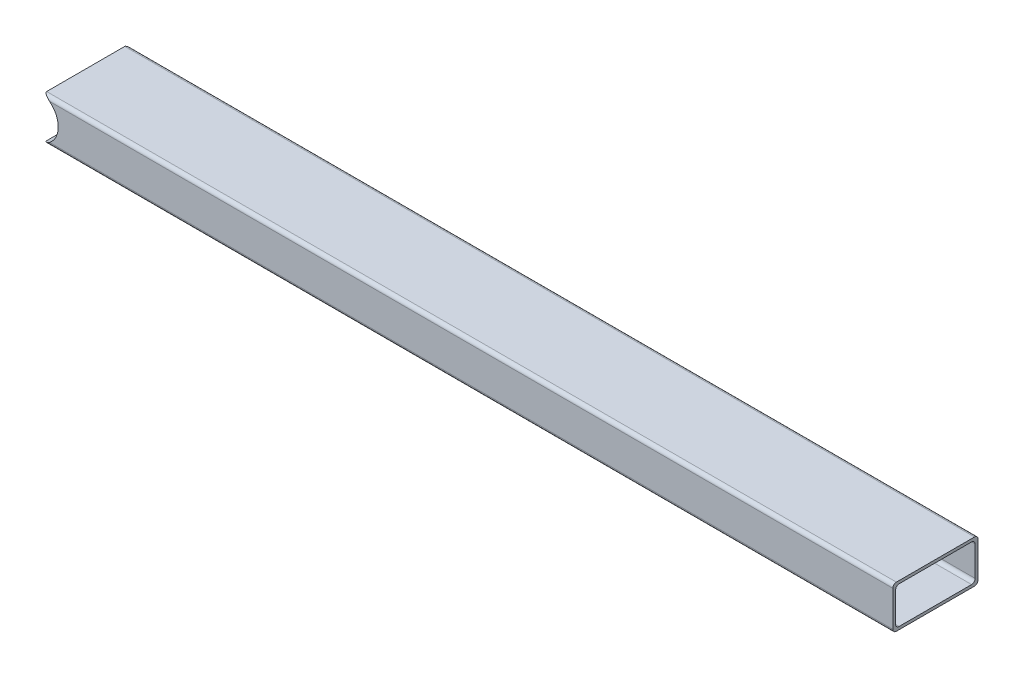
ISO-10303-21;
HEADER;
FILE_DESCRIPTION(('STEP AP214'),'2;1');
FILE_NAME('part.step','',(''),(''),'','','');
FILE_SCHEMA(('AUTOMOTIVE_DESIGN { 1 0 10303 214 1 1 1 1 }'));
ENDSEC;
DATA;
#1=APPLICATION_CONTEXT('core data for automotive mechanical design processes');
#2=APPLICATION_PROTOCOL_DEFINITION('international standard','automotive_design',2000,#1);
#3=PRODUCT_CONTEXT('',#1,'mechanical');
#4=PRODUCT('Part','Part','',(#3));
#5=PRODUCT_RELATED_PRODUCT_CATEGORY('part','',(#4));
#6=PRODUCT_DEFINITION_FORMATION('','',#4);
#7=PRODUCT_DEFINITION_CONTEXT('part definition',#1,'design');
#8=PRODUCT_DEFINITION('design','',#6,#7);
#9=PRODUCT_DEFINITION_SHAPE('','',#8);
#10=(LENGTH_UNIT() NAMED_UNIT(*) SI_UNIT(.MILLI.,.METRE.));
#11=(NAMED_UNIT(*) PLANE_ANGLE_UNIT() SI_UNIT($,.RADIAN.));
#12=(NAMED_UNIT(*) SI_UNIT($,.STERADIAN.) SOLID_ANGLE_UNIT());
#13=UNCERTAINTY_MEASURE_WITH_UNIT(LENGTH_MEASURE(1.E-05),#10,'distance_accuracy_value','');
#14=(GEOMETRIC_REPRESENTATION_CONTEXT(3) GLOBAL_UNCERTAINTY_ASSIGNED_CONTEXT((#13)) GLOBAL_UNIT_ASSIGNED_CONTEXT((#10,
#11,#12)) REPRESENTATION_CONTEXT('',''));
#15=CARTESIAN_POINT('',(0.,0.,0.));
#16=DIRECTION('',(0.,0.,1.));
#17=DIRECTION('',(1.,0.,0.));
#18=AXIS2_PLACEMENT_3D('',#15,#16,#17);
#19=CARTESIAN_POINT('',(141.560193104558,-568.340939138859,-360.400000000085));
#20=DIRECTION('',(0.,0.,1.));
#21=DIRECTION('',(1.,0.,0.));
#22=AXIS2_PLACEMENT_3D('',#19,#20,#21);
#23=CYLINDRICAL_SURFACE('',#22,15.875);
#24=CARTESIAN_POINT('',(150.671233235459,-581.341115012004,25.5002134171229));
#25=CARTESIAN_POINT('',(150.671337385321,-581.341042019641,14.9168800845537));
#26=CARTESIAN_POINT('',(150.67144153252,-581.340969027277,4.33354675198452));
#27=CARTESIAN_POINT('',(150.671608821795,-581.340851778307,-12.6666552993716));
#28=CARTESIAN_POINT('',(150.671671965554,-581.340807521701,-19.0835240181585));
#29=CARTESIAN_POINT('',(150.671735108335,-581.340763265095,-25.5003927369454));
#30=B_SPLINE_CURVE_WITH_KNOTS('',3,(#24,#25,#26,#27,#28,#29),.UNSPECIFIED.,.F.,.F.,(4,2,4),(0.,
31.75,51.0006061577506),.UNSPECIFIED.);
#31=CARTESIAN_POINT('',(150.671233238442,-581.341115009914,25.4999103394822));
#32=VERTEX_POINT('',#31);
#33=CARTESIAN_POINT('',(150.671735105353,-581.340763267185,-25.5000896593048));
#34=VERTEX_POINT('',#33);
#35=EDGE_CURVE('E390',#32,#34,#30,.T.);
#36=ORIENTED_EDGE('',*,*,#35,.T.);
#37=CARTESIAN_POINT('',(150.671735105353,-581.340763267185,-25.5000896593048));
#38=CARTESIAN_POINT('',(150.671724740158,-581.340769042363,-25.5434593284995));
#39=CARTESIAN_POINT('',(150.673347295286,-581.339633405624,-25.5868058944149));
#40=CARTESIAN_POINT('',(150.679752954679,-581.335140800036,-25.6731036581527));
#41=CARTESIAN_POINT('',(150.684532684228,-581.331786203036,-25.7160552285373));
#42=CARTESIAN_POINT('',(150.703314436117,-581.318581383306,-25.8429814188296));
#43=CARTESIAN_POINT('',(150.721764169259,-581.305587034561,-25.9260089492833));
#44=CARTESIAN_POINT('',(150.774635228102,-581.268079115068,-26.1072807184071));
#45=CARTESIAN_POINT('',(150.811865284832,-581.241520989509,-26.2042577694934));
#46=CARTESIAN_POINT('',(150.898252510698,-581.179129201596,-26.389846726002));
#47=CARTESIAN_POINT('',(150.947463625063,-581.143253536413,-26.4784182049457));
#48=CARTESIAN_POINT('',(151.081795550703,-581.04388163559,-26.6900917327287));
#49=CARTESIAN_POINT('',(151.172356877129,-580.975676536271,-26.8074819680901));
#50=CARTESIAN_POINT('',(151.364649906966,-580.827056540889,-27.0238563912852));
#51=CARTESIAN_POINT('',(151.46640559311,-580.746615283404,-27.1227997877319));
#52=CARTESIAN_POINT('',(151.650951561989,-580.596663782149,-27.2821194496427));
#53=CARTESIAN_POINT('',(151.732396042496,-580.529197188731,-27.346041720352));
#54=CARTESIAN_POINT('',(151.89767804964,-580.389331083137,-27.4648536647019));
#55=CARTESIAN_POINT('',(151.981516732739,-580.316929162827,-27.5197388835585));
#56=CARTESIAN_POINT('',(152.150543982105,-580.167722786603,-27.6207547168568));
#57=CARTESIAN_POINT('',(152.23573277091,-580.090917599328,-27.6668838714404));
#58=CARTESIAN_POINT('',(152.406667758729,-579.9333127361,-27.7504703647247));
#59=CARTESIAN_POINT('',(152.49241395954,-579.852513047269,-27.7879276754655));
#60=CARTESIAN_POINT('',(152.653521305737,-579.697200526691,-27.8501036772195));
#61=CARTESIAN_POINT('',(152.728895386147,-579.623094892509,-27.8758110739384));
#62=CARTESIAN_POINT('',(152.879144238304,-579.472349452878,-27.9202524860116));
#63=CARTESIAN_POINT('',(152.954019092371,-579.395710078309,-27.9389876804624));
#64=CARTESIAN_POINT('',(153.102645678205,-579.240430336656,-27.9691824579158));
#65=CARTESIAN_POINT('',(153.176400294298,-579.161797381228,-27.9806657715706));
#66=CARTESIAN_POINT('',(153.322679095938,-579.002613456592,-27.9961067100675));
#67=CARTESIAN_POINT('',(153.395202747289,-578.922061689377,-28.0000611464125));
#68=CARTESIAN_POINT('',(153.466900472855,-578.840746024954,-28.0000724169546));
#69=B_SPLINE_CURVE_WITH_KNOTS('',3,(#37,#38,#39,#40,#41,#42,#43,#44,#45,#46,#47,#48,#49,#50,#51,
#52,#53,#54,#55,#56,#57,#58,#59,#60,#61,#62,#63,#64,#65,#66,#67,#68),.UNSPECIFIED.,.F.,.F.,(4,2,
2,2,2,2,2,2,2,2,2,2,2,2,2,4),(0.,0.130021305051418,0.259903854250835,0.516766632018359,
0.836677150095597,1.15805561978013,1.64496489505425,2.13293842034373,2.5032067018028,
2.87365696281978,3.24416893314642,3.6146820980576,3.94078731041697,4.26683734875833,
4.59181483371996,4.91692991681842),.UNSPECIFIED.);
#70=CARTESIAN_POINT('',(153.466900472855,-578.840746024954,-28.0000724169547));
#71=VERTEX_POINT('',#70);
#72=EDGE_CURVE('E11',#34,#71,#69,.T.);
#73=ORIENTED_EDGE('',*,*,#72,.T.);
#74=CARTESIAN_POINT('',(141.560193104539,-568.340939138859,-28.0000000006659));
#75=DIRECTION('',(0.,-6.89691624925466E-06,0.999999999976216));
#76=DIRECTION('',(-8.1120670294192E-09,0.999999999976216,6.89691624925466E-06));
#77=AXIS2_PLACEMENT_3D('',#74,#75,#76);
#78=ELLIPSE('',#77,15.8750000003776,15.875);
#79=CARTESIAN_POINT('',(153.466559871156,-557.840746025454,-27.9999275817135));
#80=VERTEX_POINT('',#79);
#81=EDGE_CURVE('E50',#71,#80,#78,.T.);
#82=ORIENTED_EDGE('',*,*,#81,.T.);
#83=CARTESIAN_POINT('',(153.466559871156,-557.840746025454,-27.9999275817135));
#84=CARTESIAN_POINT('',(153.381357930957,-557.744112697063,-27.9999025387216));
#85=CARTESIAN_POINT('',(153.294992056708,-557.648572258908,-27.9943246864022));
#86=CARTESIAN_POINT('',(153.120618021198,-557.460289423955,-27.9726277123364));
#87=CARTESIAN_POINT('',(153.032610544349,-557.367545901489,-27.9565128922455));
#88=CARTESIAN_POINT('',(152.854673508493,-557.184468731572,-27.9140920744911));
#89=CARTESIAN_POINT('',(152.764733512917,-557.094168919915,-27.8876847085412));
#90=CARTESIAN_POINT('',(152.584472574793,-556.917418958187,-27.8250575623649));
#91=CARTESIAN_POINT('',(152.494151595365,-556.830969190641,-27.7888368096386));
#92=CARTESIAN_POINT('',(152.313284972021,-556.66180933274,-27.706503036701));
#93=CARTESIAN_POINT('',(152.222741708963,-556.579127331163,-27.6603269985373));
#94=CARTESIAN_POINT('',(152.042878908961,-556.418546045526,-27.5581692049726));
#95=CARTESIAN_POINT('',(151.953559735813,-556.340648160326,-27.5021845998406));
#96=CARTESIAN_POINT('',(151.77766255734,-556.19053786675,-27.3803699873678));
#97=CARTESIAN_POINT('',(151.691074662908,-556.118303075231,-27.3145820687989));
#98=CARTESIAN_POINT('',(151.521841075046,-555.979988051988,-27.1724530480761));
#99=CARTESIAN_POINT('',(151.439191522435,-555.913901732253,-27.0961225750045));
#100=CARTESIAN_POINT('',(151.283808928789,-555.791987294539,-26.9359480947763));
#101=CARTESIAN_POINT('',(151.210789428949,-555.735817266383,-26.8526474185353));
#102=CARTESIAN_POINT('',(151.07309004408,-555.631578476553,-26.6747115598047));
#103=CARTESIAN_POINT('',(151.008404264037,-555.583503980877,-26.5800844816807));
#104=CARTESIAN_POINT('',(150.902144962238,-555.505554294453,-26.3970480925649));
#105=CARTESIAN_POINT('',(150.858507098863,-555.473960631199,-26.3105921850348));
#106=CARTESIAN_POINT('',(150.782973970687,-555.419712104383,-26.1302544251232));
#107=CARTESIAN_POINT('',(150.751036862204,-555.397025367027,-26.0364005223173));
#108=CARTESIAN_POINT('',(150.708692045263,-555.367077755644,-25.8687933325471));
#109=CARTESIAN_POINT('',(150.694810978372,-555.357314178782,-25.7963758746574));
#110=CARTESIAN_POINT('',(150.680752164422,-555.347438536368,-25.6862285097691));
#111=CARTESIAN_POINT('',(150.67719255099,-555.344941325467,-25.6491177946825));
#112=CARTESIAN_POINT('',(150.672429003798,-555.34160124147,-25.5746461882155));
#113=CARTESIAN_POINT('',(150.671226703414,-555.340759515454,-25.5372851413542));
#114=CARTESIAN_POINT('',(150.671233238444,-555.340763267804,-25.4999103394823));
#115=B_SPLINE_CURVE_WITH_KNOTS('',3,(#83,#84,#85,#86,#87,#88,#89,#90,#91,#92,#93,#94,#95,#96,
#97,#98,#99,#100,#101,#102,#103,#104,#105,#106,#107,#108,#109,#110,#111,#112,#113,#114),
.UNSPECIFIED.,.F.,.F.,(4,2,2,2,2,2,2,2,2,2,2,2,2,2,2,4),(0.,0.38629182579771,0.772426048587235,
1.16246340773881,1.5525394334701,1.94516124479344,2.33789731619553,2.72899339571216,
3.11969800906227,3.49146979114634,3.86297713243278,4.16752405381394,4.47097098531204,
4.69327700735073,4.80526921589077,4.9173389961871),.UNSPECIFIED.);
#116=CARTESIAN_POINT('',(150.671233238444,-555.340763267804,-25.4999103394823));
#117=VERTEX_POINT('',#116);
#118=EDGE_CURVE('E637',#80,#117,#115,.T.);
#119=ORIENTED_EDGE('',*,*,#118,.T.);
#120=CARTESIAN_POINT('',(150.671233235462,-555.340763265713,-25.5002134171229));
#121=CARTESIAN_POINT('',(150.671337385322,-555.340836258077,-14.9168800845538));
#122=CARTESIAN_POINT('',(150.67144153252,-555.340909250441,-4.33354675198461));
#123=CARTESIAN_POINT('',(150.671608821792,-555.34102649941,12.6666552993717));
#124=CARTESIAN_POINT('',(150.671671965551,-555.341070756017,19.0835240181588));
#125=CARTESIAN_POINT('',(150.671735108331,-555.341115012623,25.5003927369459));
#126=B_SPLINE_CURVE_WITH_KNOTS('',3,(#120,#121,#122,#123,#124,#125),.UNSPECIFIED.,.F.,.F.,(4,2,
4),(0.,31.75,51.0006061577512),.UNSPECIFIED.);
#127=CARTESIAN_POINT('',(150.671735105349,-555.341115010532,25.5000896593047));
#128=VERTEX_POINT('',#127);
#129=EDGE_CURVE('E644',#117,#128,#126,.T.);
#130=ORIENTED_EDGE('',*,*,#129,.T.);
#131=CARTESIAN_POINT('',(150.671735105349,-555.341115010532,25.5000896593047));
#132=CARTESIAN_POINT('',(150.671724740154,-555.341109235355,25.5434593284995));
#133=CARTESIAN_POINT('',(150.673347295283,-555.342244872093,25.5868058944148));
#134=CARTESIAN_POINT('',(150.679752954675,-555.346737477681,25.6731036581526));
#135=CARTESIAN_POINT('',(150.684532684224,-555.350092074681,25.7160552285372));
#136=CARTESIAN_POINT('',(150.703314436114,-555.363296894412,25.8429814188295));
#137=CARTESIAN_POINT('',(150.721764169255,-555.376291243157,25.9260089492831));
#138=CARTESIAN_POINT('',(150.774635228098,-555.413799162649,26.1072807184069));
#139=CARTESIAN_POINT('',(150.811865284828,-555.440357288208,26.2042577694932));
#140=CARTESIAN_POINT('',(150.898252510694,-555.502749076121,26.3898467260018));
#141=CARTESIAN_POINT('',(150.947463625059,-555.538624741304,26.4784182049455));
#142=CARTESIAN_POINT('',(151.081795550699,-555.637996642127,26.6900917327285));
#143=CARTESIAN_POINT('',(151.172356877125,-555.706201741446,26.8074819680899));
#144=CARTESIAN_POINT('',(151.364649906962,-555.854821736829,27.0238563912849));
#145=CARTESIAN_POINT('',(151.466405593106,-555.935262994313,27.1227997877316));
#146=CARTESIAN_POINT('',(151.650951561985,-556.085214495568,27.2821194496424));
#147=CARTESIAN_POINT('',(151.732396042492,-556.152681088987,27.3460417203517));
#148=CARTESIAN_POINT('',(151.897678049636,-556.29254719458,27.4648536647016));
#149=CARTESIAN_POINT('',(151.981516732734,-556.364949114891,27.5197388835582));
#150=CARTESIAN_POINT('',(152.150543982101,-556.514155491114,27.6207547168565));
#151=CARTESIAN_POINT('',(152.235732770905,-556.590960678389,27.6668838714401));
#152=CARTESIAN_POINT('',(152.406667758725,-556.748565541617,27.7504703647244));
#153=CARTESIAN_POINT('',(152.492413959536,-556.829365230449,27.7879276754652));
#154=CARTESIAN_POINT('',(152.653521305733,-556.984677751026,27.8501036772193));
#155=CARTESIAN_POINT('',(152.728895386143,-557.058783385209,27.8758110739382));
#156=CARTESIAN_POINT('',(152.8791442383,-557.20952882484,27.9202524860114));
#157=CARTESIAN_POINT('',(152.954019092368,-557.286168199409,27.9389876804623));
#158=CARTESIAN_POINT('',(153.102645678201,-557.441447941061,27.9691824579157));
#159=CARTESIAN_POINT('',(153.176400294294,-557.520080896489,27.9806657715705));
#160=CARTESIAN_POINT('',(153.322679095935,-557.679264821126,27.9961067100674));
#161=CARTESIAN_POINT('',(153.395202747285,-557.75981658834,28.0000611464124));
#162=CARTESIAN_POINT('',(153.466900472852,-557.841132252764,28.0000724169545));
#163=B_SPLINE_CURVE_WITH_KNOTS('',3,(#131,#132,#133,#134,#135,#136,#137,#138,#139,#140,#141,
#142,#143,#144,#145,#146,#147,#148,#149,#150,#151,#152,#153,#154,#155,#156,#157,#158,#159,#160,
#161,#162),.UNSPECIFIED.,.F.,.F.,(4,2,2,2,2,2,2,2,2,2,2,2,2,2,2,4),(0.,0.130021305051394,
0.25990385425079,0.516766632018279,0.836677150095485,1.15805561977994,1.64496489505399,
2.13293842034328,2.50320670180239,2.8736569628193,3.24416893314581,3.61468209805697,
3.9407873104167,4.26683734875828,4.59181483372026,4.91692991681885),.UNSPECIFIED.);
#164=CARTESIAN_POINT('',(153.466900472852,-557.841132252764,28.0000724169546));
#165=VERTEX_POINT('',#164);
#166=EDGE_CURVE('E651',#128,#165,#163,.T.);
#167=ORIENTED_EDGE('',*,*,#166,.T.);
#168=CARTESIAN_POINT('',(141.560193104536,-568.340939138859,28.0000000006659));
#169=DIRECTION('',(0.,6.89691624925466E-06,-0.999999999976216));
#170=DIRECTION('',(-8.1120670294192E-09,0.999999999976216,6.89691624925466E-06));
#171=AXIS2_PLACEMENT_3D('',#168,#169,#170);
#172=ELLIPSE('',#171,15.8750000003776,15.875);
#173=CARTESIAN_POINT('',(153.466559871153,-578.841132252264,27.9999275817134));
#174=VERTEX_POINT('',#173);
#175=EDGE_CURVE('E658',#165,#174,#172,.T.);
#176=ORIENTED_EDGE('',*,*,#175,.T.);
#177=CARTESIAN_POINT('',(153.466559871153,-578.841132252264,27.9999275817134));
#178=CARTESIAN_POINT('',(153.381357930954,-578.937765580655,27.9999025387215));
#179=CARTESIAN_POINT('',(153.294992056705,-579.03330601881,27.9943246864022));
#180=CARTESIAN_POINT('',(153.120618021195,-579.221588853763,27.9726277123363));
#181=CARTESIAN_POINT('',(153.032610544346,-579.314332376229,27.9565128922454));
#182=CARTESIAN_POINT('',(152.854673508491,-579.497409546146,27.914092074491));
#183=CARTESIAN_POINT('',(152.764733512914,-579.587709357803,27.8876847085412));
#184=CARTESIAN_POINT('',(152.584472574791,-579.764459319531,27.8250575623649));
#185=CARTESIAN_POINT('',(152.494151595362,-579.850909087076,27.7888368096385));
#186=CARTESIAN_POINT('',(152.313284972019,-580.020068944978,27.706503036701));
#187=CARTESIAN_POINT('',(152.22274170896,-580.102750946555,27.6603269985373));
#188=CARTESIAN_POINT('',(152.042878908959,-580.263332232191,27.5581692049726));
#189=CARTESIAN_POINT('',(151.953559735811,-580.341230117391,27.5021845998406));
#190=CARTESIAN_POINT('',(151.777662557337,-580.491340410967,27.3803699873678));
#191=CARTESIAN_POINT('',(151.691074662905,-580.563575202487,27.3145820687989));
#192=CARTESIAN_POINT('',(151.521841075043,-580.70189022573,27.1724530480761));
#193=CARTESIAN_POINT('',(151.439191522433,-580.767976545464,27.0961225750045));
#194=CARTESIAN_POINT('',(151.283808928786,-580.889890983179,26.9359480947763));
#195=CARTESIAN_POINT('',(151.210789428946,-580.946061011334,26.8526474185353));
#196=CARTESIAN_POINT('',(151.073090044077,-581.050299801165,26.6747115598046));
#197=CARTESIAN_POINT('',(151.008404264035,-581.09837429684,26.5800844816806));
#198=CARTESIAN_POINT('',(150.902144962235,-581.176323983264,26.3970480925648));
#199=CARTESIAN_POINT('',(150.858507098861,-581.207917646519,26.3105921850346));
#200=CARTESIAN_POINT('',(150.782973970685,-581.262166173334,26.1302544251231));
#201=CARTESIAN_POINT('',(150.751036862202,-581.284852910691,26.0364005223172));
#202=CARTESIAN_POINT('',(150.708692045261,-581.314800522073,25.868793332547));
#203=CARTESIAN_POINT('',(150.69481097837,-581.324564098935,25.7963758746574));
#204=CARTESIAN_POINT('',(150.680752164419,-581.33443974135,25.6862285097691));
#205=CARTESIAN_POINT('',(150.677192550988,-581.336936952251,25.6491177946824));
#206=CARTESIAN_POINT('',(150.672429003796,-581.340277036248,25.5746461882154));
#207=CARTESIAN_POINT('',(150.671226703412,-581.341118762264,25.5372851413542));
#208=CARTESIAN_POINT('',(150.671233238442,-581.341115009914,25.4999103394822));
#209=B_SPLINE_CURVE_WITH_KNOTS('',3,(#177,#178,#179,#180,#181,#182,#183,#184,#185,#186,#187,
#188,#189,#190,#191,#192,#193,#194,#195,#196,#197,#198,#199,#200,#201,#202,#203,#204,#205,#206,
#207,#208),.UNSPECIFIED.,.F.,.F.,(4,2,2,2,2,2,2,2,2,2,2,2,2,2,2,4),(0.,0.386291825797572,
0.772426048587058,1.16246340773859,1.55253943346974,1.94516124479306,2.33789731619514,
2.72899339571181,3.11969800906197,3.49146979114601,3.86297713243245,4.1675240538136,
4.47097098531167,4.69327700735033,4.80526921589035,4.91733899618667),.UNSPECIFIED.);
#210=EDGE_CURVE('E662',#174,#32,#209,.T.);
#211=ORIENTED_EDGE('',*,*,#210,.T.);
#212=EDGE_LOOP('',(#36,#73,#82,#119,#130,#167,#176,#211));
#213=FACE_BOUND('',#212,.T.);
#214=CARTESIAN_POINT('',(146.758396152766,-553.341128804412,27.5001034530897));
#215=CARTESIAN_POINT('',(146.758383506119,-553.341125064639,27.5275598936779));
#216=CARTESIAN_POINT('',(146.759703445409,-553.341581806523,27.5549967846341));
#217=CARTESIAN_POINT('',(146.764884384735,-553.343378485478,27.6095518705151));
#218=CARTESIAN_POINT('',(146.768740779189,-553.344716821797,27.6366705525607));
#219=CARTESIAN_POINT('',(146.783767278766,-553.34994146609,27.7163824585175));
#220=CARTESIAN_POINT('',(146.798403731944,-553.355040216316,27.7682628578147));
#221=CARTESIAN_POINT('',(146.84068985457,-553.369880241383,27.8838659300772));
#222=CARTESIAN_POINT('',(146.87092256138,-553.380554021841,27.9464885830141));
#223=CARTESIAN_POINT('',(146.940184541986,-553.405321399365,28.0663248734858));
#224=CARTESIAN_POINT('',(146.979277548349,-553.41943983325,28.1234948322476));
#225=CARTESIAN_POINT('',(147.060865553156,-553.449330335612,28.2295814642584));
#226=CARTESIAN_POINT('',(147.103051422029,-553.464967179512,28.2787800731227));
#227=CARTESIAN_POINT('',(147.191004800599,-553.498034967554,28.3732482419194));
#228=CARTESIAN_POINT('',(147.23677570906,-553.515467619252,28.4185139854649));
#229=CARTESIAN_POINT('',(147.377887873853,-553.570016025369,28.5493858370124));
#230=CARTESIAN_POINT('',(147.476972892164,-553.609362089263,28.6300000012975));
#231=CARTESIAN_POINT('',(147.698959399637,-553.700305964486,28.7951880586319));
#232=CARTESIAN_POINT('',(147.822903607052,-553.752828626621,28.877792157373));
#233=CARTESIAN_POINT('',(148.07486111142,-553.86358735437,29.0325231818216));
#234=CARTESIAN_POINT('',(148.202879040178,-553.921830092901,29.1046376213632));
#235=CARTESIAN_POINT('',(148.461302124441,-554.043709310816,29.2400834667107));
#236=CARTESIAN_POINT('',(148.591711344623,-554.107355803816,29.3033979668508));
#237=CARTESIAN_POINT('',(148.85361290289,-554.239762016157,29.4219378857615));
#238=CARTESIAN_POINT('',(148.985105384097,-554.30852242111,29.477162216939));
#239=CARTESIAN_POINT('',(149.269030920686,-554.46219937989,29.5878778398314));
#240=CARTESIAN_POINT('',(149.421520063953,-554.547960123931,29.6420578669621));
#241=CARTESIAN_POINT('',(149.726096362838,-554.726065418531,29.7399427483024));
#242=CARTESIAN_POINT('',(149.878183357702,-554.818412280581,29.7836439010942));
#243=CARTESIAN_POINT('',(150.180599987742,-555.009170198938,29.8598226414711));
#244=CARTESIAN_POINT('',(150.330933899069,-555.107559010696,29.8923387949348));
#245=CARTESIAN_POINT('',(150.629539761159,-555.310393822115,29.9453467731821));
#246=CARTESIAN_POINT('',(150.777812979184,-555.414835874483,29.9658463391113));
#247=CARTESIAN_POINT('',(150.995672085474,-555.573985230232,29.9863222571483));
#248=CARTESIAN_POINT('',(151.066374107322,-555.626541175708,29.9914303877845));
#249=CARTESIAN_POINT('',(151.207014372407,-555.732916127248,29.9983111502308));
#250=CARTESIAN_POINT('',(151.276952404044,-555.786735470853,30.000082880147));
#251=CARTESIAN_POINT('',(151.346448652589,-555.841146046644,30.0000862107396));
#252=B_SPLINE_CURVE_WITH_KNOTS('',3,(#214,#215,#216,#217,#218,#219,#220,#221,#222,#223,#224,
#225,#226,#227,#228,#229,#230,#231,#232,#233,#234,#235,#236,#237,#238,#239,#240,#241,#242,#243,
#244,#245,#246,#247,#248,#249,#250,#251),.UNSPECIFIED.,.F.,.F.,(4,2,2,2,2,2,2,2,2,2,2,2,2,2,2,2,
2,2,4),(0.,0.082299178362135,0.164449332581217,0.326003113518892,0.535884208219377,
0.747325802347879,0.947035043599102,1.14693596396042,1.5470026015685,2.02019895403163,
2.49395403662001,2.96860703428869,3.44332378297308,3.99234697338176,4.5415638086866,
5.08886750284694,5.63581823266106,5.90048430672082,6.16522191489514),.UNSPECIFIED.);
#253=CARTESIAN_POINT('',(146.758396152766,-553.341128804412,27.5001034530897));
#254=VERTEX_POINT('',#253);
#255=CARTESIAN_POINT('',(151.346448652589,-555.841146046644,30.0000862107396));
#256=VERTEX_POINT('',#255);
#257=EDGE_CURVE('E335',#254,#256,#252,.T.);
#258=ORIENTED_EDGE('',*,*,#257,.F.);
#259=CARTESIAN_POINT('',(146.757301430917,-553.340749471928,-27.5001996232429));
#260=CARTESIAN_POINT('',(146.757512105625,-553.340822464292,-16.9168662922581));
#261=CARTESIAN_POINT('',(146.75772276599,-553.340895456656,-6.33353296127309));
#262=CARTESIAN_POINT('',(146.758087668632,-553.341021901514,12.0000024233849));
#263=CARTESIAN_POINT('',(146.758241917561,-553.341075354008,19.7502044770578));
#264=CARTESIAN_POINT('',(146.758396158798,-553.341128806503,27.5004065307308));
#265=B_SPLINE_CURVE_WITH_KNOTS('',3,(#259,#260,#261,#262,#263,#264),.UNSPECIFIED.,.F.,.F.,(4,2,
4),(0.,31.75,55.0006061661765),.UNSPECIFIED.);
#266=CARTESIAN_POINT('',(146.75730143695,-553.340749474019,-27.4998965456022));
#267=VERTEX_POINT('',#266);
#268=EDGE_CURVE('E342',#267,#254,#265,.T.);
#269=ORIENTED_EDGE('',*,*,#268,.F.);
#270=CARTESIAN_POINT('',(151.345920071783,-555.840732231669,-29.9999137878334));
#271=CARTESIAN_POINT('',(151.271453052883,-555.782434634588,-29.9999084354865));
#272=CARTESIAN_POINT('',(151.196479439875,-555.724816825368,-29.9978744393815));
#273=CARTESIAN_POINT('',(151.045659959524,-555.611035039285,-29.9899916378659));
#274=CARTESIAN_POINT('',(150.969814296135,-555.554870732081,-29.9841437073136));
#275=CARTESIAN_POINT('',(150.741268773541,-555.388761369724,-29.9612550880884));
#276=CARTESIAN_POINT('',(150.587423344448,-555.281092653648,-29.9388686685593));
#277=CARTESIAN_POINT('',(150.274680193987,-555.070309357054,-29.8807977796151));
#278=CARTESIAN_POINT('',(150.115742536353,-554.967325286415,-29.8448614286396));
#279=CARTESIAN_POINT('',(149.796627179622,-554.768462553109,-29.7608545829274));
#280=CARTESIAN_POINT('',(149.636449377316,-554.672584489,-29.712783067513));
#281=CARTESIAN_POINT('',(149.306121918932,-554.482559804499,-29.6018532315513));
#282=CARTESIAN_POINT('',(149.135953055814,-554.388865748724,-29.538278372024));
#283=CARTESIAN_POINT('',(148.796358410832,-554.209754703375,-29.3980273567172));
#284=CARTESIAN_POINT('',(148.626933525418,-554.124345953008,-29.3213383649067));
#285=CARTESIAN_POINT('',(148.375827811704,-554.003181225568,-29.1959858417192));
#286=CARTESIAN_POINT('',(148.29302054563,-553.96412174738,-29.1527132648691));
#287=CARTESIAN_POINT('',(148.1285047881,-553.888219628187,-29.0623207252862));
#288=CARTESIAN_POINT('',(148.046796083986,-553.851376553194,-29.015201520039));
#289=CARTESIAN_POINT('',(147.885136025152,-553.780083626469,-28.916721890852));
#290=CARTESIAN_POINT('',(147.805181660836,-553.745629414135,-28.8653695904036));
#291=CARTESIAN_POINT('',(147.647674536214,-553.679238011207,-28.7576407988084));
#292=CARTESIAN_POINT('',(147.570120355142,-553.647299313581,-28.7012673596076));
#293=CARTESIAN_POINT('',(147.460860260435,-553.603264100886,-28.6154992221256));
#294=CARTESIAN_POINT('',(147.427677499313,-553.590024256849,-28.5885667533788));
#295=CARTESIAN_POINT('',(147.362204124438,-553.564148780358,-28.5333635772678));
#296=CARTESIAN_POINT('',(147.329913513343,-553.551513149706,-28.5050928659171));
#297=CARTESIAN_POINT('',(147.234403445353,-553.514489196861,-28.4178082544946));
#298=CARTESIAN_POINT('',(147.17281366497,-553.491091416013,-28.3565274798861));
#299=CARTESIAN_POINT('',(147.055625560405,-553.447322725909,-28.2254342133563));
#300=CARTESIAN_POINT('',(147.000140167462,-553.427006853165,-28.1554998312375));
#301=CARTESIAN_POINT('',(146.901753593934,-553.391489240891,-28.006741060176));
#302=CARTESIAN_POINT('',(146.858718970712,-553.376232993505,-27.928024513863));
#303=CARTESIAN_POINT('',(146.804382601511,-553.357126526072,-27.7907074116207));
#304=CARTESIAN_POINT('',(146.787242032427,-553.351151222994,-27.7348047868349));
#305=CARTESIAN_POINT('',(146.769553440306,-553.344998749824,-27.6485270698416));
#306=CARTESIAN_POINT('',(146.764990457726,-553.343415147356,-27.6190565453546));
#307=CARTESIAN_POINT('',(146.758851148954,-553.341286333019,-27.5596986799841));
#308=CARTESIAN_POINT('',(146.757282134504,-553.340743663255,-27.5298104977841));
#309=CARTESIAN_POINT('',(146.75730143695,-553.340749474019,-27.4998965456022));
#310=B_SPLINE_CURVE_WITH_KNOTS('',3,(#270,#271,#272,#273,#274,#275,#276,#277,#278,#279,#280,
#281,#282,#283,#284,#285,#286,#287,#288,#289,#290,#291,#292,#293,#294,#295,#296,#297,#298,#299,
#300,#301,#302,#303,#304,#305,#306,#307,#308,#309),.UNSPECIFIED.,.F.,.F.,(4,2,2,2,2,2,2,2,2,2,2,
2,2,2,2,2,2,2,2,4),(0.,0.283657583856543,0.567250123861553,1.13391493814411,1.71167907179381,
2.28949181685947,2.90212655457389,3.51536440399996,3.81908839390588,4.12275271749275,
4.42584728879707,4.72875887435708,4.8629522153999,4.99714595622908,5.26659373415616,
5.54039664577786,5.81114600941326,5.98639659888671,6.07582931022911,6.16548015226193),.UNSPECIFIED.);
#311=CARTESIAN_POINT('',(151.345920071783,-555.840732231669,-29.9999137878334));
#312=VERTEX_POINT('',#311);
#313=EDGE_CURVE('E348',#312,#267,#310,.T.);
#314=ORIENTED_EDGE('',*,*,#313,.F.);
#315=CARTESIAN_POINT('',(141.560193104539,-568.340939138859,-30.0000000007135));
#316=DIRECTION('',(0.,-6.89691624936049E-06,0.999999999976216));
#317=DIRECTION('',(-8.11206702929473E-09,0.999999999976216,6.89691624936049E-06));
#318=AXIS2_PLACEMENT_3D('',#315,#316,#317);
#319=ELLIPSE('',#318,15.8750000003776,15.875);
#320=CARTESIAN_POINT('',(151.346448652593,-580.840732231074,-30.0000862107396));
#321=VERTEX_POINT('',#320);
#322=EDGE_CURVE('E354',#321,#312,#319,.T.);
#323=ORIENTED_EDGE('',*,*,#322,.F.);
#324=CARTESIAN_POINT('',(146.758396152771,-583.340749473305,-27.5001034530897));
#325=CARTESIAN_POINT('',(146.758383506124,-583.340753213078,-27.5275598936779));
#326=CARTESIAN_POINT('',(146.759703445415,-583.340296471194,-27.5549967846341));
#327=CARTESIAN_POINT('',(146.76488438474,-583.338499792239,-27.6095518705152));
#328=CARTESIAN_POINT('',(146.768740779194,-583.337161455921,-27.6366705525608));
#329=CARTESIAN_POINT('',(146.783767278771,-583.331936811628,-27.7163824585176));
#330=CARTESIAN_POINT('',(146.798403731949,-583.326838061401,-27.7682628578148));
#331=CARTESIAN_POINT('',(146.840689854575,-583.311998036334,-27.8838659300774));
#332=CARTESIAN_POINT('',(146.870922561386,-583.301324255876,-27.9464885830143));
#333=CARTESIAN_POINT('',(146.940184541992,-583.276556878352,-28.066324873486));
#334=CARTESIAN_POINT('',(146.979277548354,-583.262438444467,-28.1234948322479));
#335=CARTESIAN_POINT('',(147.060865553162,-583.232547942105,-28.2295814642588));
#336=CARTESIAN_POINT('',(147.103051422035,-583.216911098205,-28.278780073123));
#337=CARTESIAN_POINT('',(147.191004800605,-583.183843310163,-28.3732482419198));
#338=CARTESIAN_POINT('',(147.236775709066,-583.166410658465,-28.4185139854654));
#339=CARTESIAN_POINT('',(147.377887873859,-583.111862252348,-28.5493858370129));
#340=CARTESIAN_POINT('',(147.47697289217,-583.072516188454,-28.6300000012981));
#341=CARTESIAN_POINT('',(147.698959399643,-582.981572313231,-28.7951880586325));
#342=CARTESIAN_POINT('',(147.822903607058,-582.929049651096,-28.8777921573736));
#343=CARTESIAN_POINT('',(148.074861111426,-582.818290923347,-29.0325231818223));
#344=CARTESIAN_POINT('',(148.202879040185,-582.760048184816,-29.1046376213639));
#345=CARTESIAN_POINT('',(148.461302124447,-582.638168966901,-29.2400834667115));
#346=CARTESIAN_POINT('',(148.59171134463,-582.574522473901,-29.3033979668516));
#347=CARTESIAN_POINT('',(148.853612902897,-582.44211626156,-29.4219378857623));
#348=CARTESIAN_POINT('',(148.985105384103,-582.373355856606,-29.4771622169398));
#349=CARTESIAN_POINT('',(149.269030920692,-582.219678897826,-29.5878778398322));
#350=CARTESIAN_POINT('',(149.42152006396,-582.133918153785,-29.6420578669628));
#351=CARTESIAN_POINT('',(149.726096362845,-581.955812859185,-29.739942748303));
#352=CARTESIAN_POINT('',(149.878183357708,-581.863465997135,-29.7836439010948));
#353=CARTESIAN_POINT('',(150.180599987748,-581.672708078778,-29.8598226414716));
#354=CARTESIAN_POINT('',(150.330933899076,-581.57431926702,-29.8923387949352));
#355=CARTESIAN_POINT('',(150.629539761165,-581.371484455601,-29.9453467731824));
#356=CARTESIAN_POINT('',(150.777812979191,-581.267042403232,-29.9658463391116));
#357=CARTESIAN_POINT('',(150.99567208548,-581.107893047484,-29.9863222571484));
#358=CARTESIAN_POINT('',(151.066374107328,-581.055337102008,-29.9914303877845));
#359=CARTESIAN_POINT('',(151.207014372412,-580.948962150469,-29.9983111502308));
#360=CARTESIAN_POINT('',(151.276952404049,-580.895142806864,-30.000082880147));
#361=CARTESIAN_POINT('',(151.346448652593,-580.840732231074,-30.0000862107396));
#362=B_SPLINE_CURVE_WITH_KNOTS('',3,(#324,#325,#326,#327,#328,#329,#330,#331,#332,#333,#334,
#335,#336,#337,#338,#339,#340,#341,#342,#343,#344,#345,#346,#347,#348,#349,#350,#351,#352,#353,
#354,#355,#356,#357,#358,#359,#360,#361),.UNSPECIFIED.,.F.,.F.,(4,2,2,2,2,2,2,2,2,2,2,2,2,2,2,2,
2,2,4),(0.,0.082299178362159,0.16444933258127,0.326003113519046,0.535884208219636,
0.747325802348241,0.9470350435996,1.14693596396102,1.54700260156929,2.02019895403268,
2.4939540366214,2.96860703429029,3.44332378297492,3.99234697338359,4.54156380868856,
5.08886750284894,5.63581823266317,5.9004843067213,6.16522191489418),.UNSPECIFIED.);
#363=CARTESIAN_POINT('',(146.758396152771,-583.340749473305,-27.5001034530897));
#364=VERTEX_POINT('',#363);
#365=EDGE_CURVE('E373',#364,#321,#362,.T.);
#366=ORIENTED_EDGE('',*,*,#365,.F.);
#367=CARTESIAN_POINT('',(146.757301430916,-583.341128805789,27.5001996232428));
#368=CARTESIAN_POINT('',(146.757512105626,-583.341055813425,16.9168662922581));
#369=CARTESIAN_POINT('',(146.757722765992,-583.340982821062,6.33353296127305));
#370=CARTESIAN_POINT('',(146.758087668636,-583.340856376204,-12.0000024233848));
#371=CARTESIAN_POINT('',(146.758241917565,-583.340802923709,-19.7502044770576));
#372=CARTESIAN_POINT('',(146.758396158803,-583.340749471215,-27.5004065307304));
#373=B_SPLINE_CURVE_WITH_KNOTS('',3,(#367,#368,#369,#370,#371,#372),.UNSPECIFIED.,.F.,.F.,(4,2,
4),(0.,31.75,55.0006061661761),.UNSPECIFIED.);
#374=CARTESIAN_POINT('',(146.75730143695,-583.341128803699,27.4998965456022));
#375=VERTEX_POINT('',#374);
#376=EDGE_CURVE('E379',#375,#364,#373,.T.);
#377=ORIENTED_EDGE('',*,*,#376,.F.);
#378=CARTESIAN_POINT('',(151.34592007178,-580.841146046049,29.9999137878334));
#379=CARTESIAN_POINT('',(151.27145305288,-580.89944364313,29.9999084354864));
#380=CARTESIAN_POINT('',(151.196479439873,-580.95706145235,29.9978744393815));
#381=CARTESIAN_POINT('',(151.045659959522,-581.070843238433,29.9899916378658));
#382=CARTESIAN_POINT('',(150.969814296132,-581.127007545636,29.9841437073136));
#383=CARTESIAN_POINT('',(150.741268773539,-581.293116907993,29.9612550880883));
#384=CARTESIAN_POINT('',(150.587423344445,-581.400785624069,29.9388686685592));
#385=CARTESIAN_POINT('',(150.274680193984,-581.611568920663,29.880797779615));
#386=CARTESIAN_POINT('',(150.115742536351,-581.714552991302,29.8448614286396));
#387=CARTESIAN_POINT('',(149.79662717962,-581.913415724608,29.7608545829273));
#388=CARTESIAN_POINT('',(149.636449377314,-582.009293788718,29.7127830675129));
#389=CARTESIAN_POINT('',(149.30612191893,-582.199318473218,29.6018532315512));
#390=CARTESIAN_POINT('',(149.135953055812,-582.293012528993,29.5382783720239));
#391=CARTESIAN_POINT('',(148.79635841083,-582.472123574343,29.398027356717));
#392=CARTESIAN_POINT('',(148.626933525416,-582.557532324709,29.3213383649065));
#393=CARTESIAN_POINT('',(148.375827811702,-582.67869705215,29.195985841719));
#394=CARTESIAN_POINT('',(148.293020545629,-582.717756530338,29.1527132648689));
#395=CARTESIAN_POINT('',(148.128504788099,-582.793658649531,29.062320725286));
#396=CARTESIAN_POINT('',(148.046796083985,-582.830501724524,29.0152015200388));
#397=CARTESIAN_POINT('',(147.885136025151,-582.901794651248,28.9167218908517));
#398=CARTESIAN_POINT('',(147.805181660834,-582.936248863582,28.8653695904034));
#399=CARTESIAN_POINT('',(147.647674536212,-583.00264026651,28.757640798808));
#400=CARTESIAN_POINT('',(147.57012035514,-583.034578964136,28.7012673596073));
#401=CARTESIAN_POINT('',(147.460860260434,-583.078614176831,28.6154992221252));
#402=CARTESIAN_POINT('',(147.427677499311,-583.091854020869,28.5885667533784));
#403=CARTESIAN_POINT('',(147.362204124436,-583.117729497359,28.5333635772674));
#404=CARTESIAN_POINT('',(147.329913513342,-583.130365128012,28.5050928659166));
#405=CARTESIAN_POINT('',(147.234403445352,-583.167389080857,28.4178082544941));
#406=CARTESIAN_POINT('',(147.172813664969,-583.190786861704,28.3565274798856));
#407=CARTESIAN_POINT('',(147.055625560404,-583.234555551809,28.2254342133559));
#408=CARTESIAN_POINT('',(147.000140167461,-583.254871424552,28.155499831237));
#409=CARTESIAN_POINT('',(146.901753593933,-583.290389036827,28.0067410601755));
#410=CARTESIAN_POINT('',(146.858718970711,-583.305645284212,27.9280245138624));
#411=CARTESIAN_POINT('',(146.80438260151,-583.324751751645,27.7907074116203));
#412=CARTESIAN_POINT('',(146.787242032427,-583.330727054723,27.7348047868345));
#413=CARTESIAN_POINT('',(146.769553440305,-583.336879527894,27.6485270698414));
#414=CARTESIAN_POINT('',(146.764990457726,-583.338463130361,27.6190565453544));
#415=CARTESIAN_POINT('',(146.758851148953,-583.340591944698,27.559698679984));
#416=CARTESIAN_POINT('',(146.757282134503,-583.341134614463,27.5298104977841));
#417=CARTESIAN_POINT('',(146.75730143695,-583.341128803699,27.4998965456022));
#418=B_SPLINE_CURVE_WITH_KNOTS('',3,(#378,#379,#380,#381,#382,#383,#384,#385,#386,#387,#388,
#389,#390,#391,#392,#393,#394,#395,#396,#397,#398,#399,#400,#401,#402,#403,#404,#405,#406,#407,
#408,#409,#410,#411,#412,#413,#414,#415,#416,#417),.UNSPECIFIED.,.F.,.F.,(4,2,2,2,2,2,2,2,2,2,2,
2,2,2,2,2,2,2,2,4),(0.,0.283657583856521,0.56725012386151,1.133914938144,1.71167907179363,
2.28949181685926,2.90212655457352,3.5153644039995,3.81908839390537,4.1227527174922,
4.42584728879649,4.7287588743565,4.86295221539931,4.99714595622843,5.26659373415545,
5.54039664577702,5.81114600941237,5.98639659888551,6.07582931022776,6.16548015226043),.UNSPECIFIED.);
#419=CARTESIAN_POINT('',(151.34592007178,-580.841146046049,29.9999137878334));
#420=VERTEX_POINT('',#419);
#421=EDGE_CURVE('E246',#420,#375,#418,.T.);
#422=ORIENTED_EDGE('',*,*,#421,.F.);
#423=CARTESIAN_POINT('',(141.560193104536,-568.340939138859,30.0000000007135));
#424=DIRECTION('',(0.,6.89691624922172E-06,-0.999999999976216));
#425=DIRECTION('',(-8.11206702945795E-09,0.999999999976216,6.89691624922172E-06));
#426=AXIS2_PLACEMENT_3D('',#423,#424,#425);
#427=ELLIPSE('',#426,15.8750000003776,15.875);
#428=EDGE_CURVE('E45',#256,#420,#427,.T.);
#429=ORIENTED_EDGE('',*,*,#428,.F.);
#430=EDGE_LOOP('',(#258,#269,#314,#323,#366,#377,#422,#429));
#431=FACE_BOUND('',#430,.T.);
#432=ADVANCED_FACE('F41',(#213,#431),#23,.F.);
#433=CARTESIAN_POINT('',(745.144599762804,0.,0.));
#434=DIRECTION('',(-1.,0.,0.));
#435=DIRECTION('',(0.,0.,1.));
#436=AXIS2_PLACEMENT_3D('',#433,#434,#435);
#437=PLANE('',#436);
#438=CARTESIAN_POINT('',(745.144599762807,-580.841128803758,27.4999137878928));
#439=DIRECTION('',(1.,0.,0.));
#440=DIRECTION('',(0.,0.,-1.));
#441=AXIS2_PLACEMENT_3D('',#438,#439,#440);
#442=CIRCLE('',#441,2.5);
#443=CARTESIAN_POINT('',(745.144599762807,-580.841146046049,29.9999137878334));
#444=VERTEX_POINT('',#443);
#445=CARTESIAN_POINT('',(745.144599762807,-583.341128803699,27.4998965456022));
#446=VERTEX_POINT('',#445);
#447=EDGE_CURVE('E243',#444,#446,#442,.T.);
#448=ORIENTED_EDGE('',*,*,#447,.T.);
#449=DIRECTION('',(0.,6.89691624821233E-06,-0.999999999976216));
#450=VECTOR('',#449,1.);
#451=CARTESIAN_POINT('',(745.144599762807,-583.341128803699,27.4998965456022));
#452=LINE('',#451,#450);
#453=CARTESIAN_POINT('',(745.144599762807,-583.340749473305,-27.5001034530897));
#454=VERTEX_POINT('',#453);
#455=EDGE_CURVE('E247',#446,#454,#452,.T.);
#456=ORIENTED_EDGE('',*,*,#455,.T.);
#457=CARTESIAN_POINT('',(745.144599762807,-580.840749473364,-27.5000862107991));
#458=DIRECTION('',(1.,0.,0.));
#459=DIRECTION('',(0.,0.,-1.));
#460=AXIS2_PLACEMENT_3D('',#457,#458,#459);
#461=CIRCLE('',#460,2.5);
#462=CARTESIAN_POINT('',(745.144599762807,-580.840732231074,-30.0000862107396));
#463=VERTEX_POINT('',#462);
#464=EDGE_CURVE('E253',#454,#463,#461,.T.);
#465=ORIENTED_EDGE('',*,*,#464,.T.);
#466=DIRECTION('',(0.,0.999999999976216,6.89691624936049E-06));
#467=VECTOR('',#466,1.);
#468=CARTESIAN_POINT('',(745.144599762807,-555.840732231669,-29.9999137878334));
#469=LINE('',#468,#467);
#470=CARTESIAN_POINT('',(745.144599762807,-555.840732231669,-29.9999137878334));
#471=VERTEX_POINT('',#470);
#472=EDGE_CURVE('E263',#463,#471,#469,.T.);
#473=ORIENTED_EDGE('',*,*,#472,.T.);
#474=CARTESIAN_POINT('',(745.144599762807,-555.840749473959,-27.4999137878928));
#475=DIRECTION('',(1.,0.,0.));
#476=DIRECTION('',(0.,0.,1.));
#477=AXIS2_PLACEMENT_3D('',#474,#475,#476);
#478=CIRCLE('',#477,2.5);
#479=CARTESIAN_POINT('',(745.144599762807,-553.340749474019,-27.4998965456022));
#480=VERTEX_POINT('',#479);
#481=EDGE_CURVE('E273',#471,#480,#478,.T.);
#482=ORIENTED_EDGE('',*,*,#481,.T.);
#483=DIRECTION('',(0.,-6.89691624821233E-06,0.999999999976216));
#484=VECTOR('',#483,1.);
#485=CARTESIAN_POINT('',(745.144599762807,-553.341128804412,27.5001034530897));
#486=LINE('',#485,#484);
#487=CARTESIAN_POINT('',(745.144599762807,-553.341128804412,27.5001034530897));
#488=VERTEX_POINT('',#487);
#489=EDGE_CURVE('E283',#480,#488,#486,.T.);
#490=ORIENTED_EDGE('',*,*,#489,.T.);
#491=CARTESIAN_POINT('',(745.144599762807,-555.841128804353,27.500086210799));
#492=DIRECTION('',(1.,0.,0.));
#493=DIRECTION('',(0.,0.,-1.));
#494=AXIS2_PLACEMENT_3D('',#491,#492,#493);
#495=CIRCLE('',#494,2.50000000000006);
#496=CARTESIAN_POINT('',(745.144599762807,-555.841146046644,30.0000862107396));
#497=VERTEX_POINT('',#496);
#498=EDGE_CURVE('E293',#488,#497,#495,.T.);
#499=ORIENTED_EDGE('',*,*,#498,.T.);
#500=DIRECTION('',(0.,-0.999999999976216,-6.89691624922172E-06));
#501=VECTOR('',#500,1.);
#502=CARTESIAN_POINT('',(745.144599762807,-555.841146046644,30.0000862107396));
#503=LINE('',#502,#501);
#504=EDGE_CURVE('E236',#497,#444,#503,.T.);
#505=ORIENTED_EDGE('',*,*,#504,.T.);
#506=EDGE_LOOP('',(#448,#456,#465,#473,#482,#490,#499,#505));
#507=FACE_BOUND('',#506,.T.);
#508=DIRECTION('',(0.,6.89691625161622E-06,-0.999999999976216));
#509=VECTOR('',#508,1.);
#510=CARTESIAN_POINT('',(745.144599762807,-581.341115009914,25.4999103394822));
#511=LINE('',#510,#509);
#512=CARTESIAN_POINT('',(745.144599762807,-581.341115009914,25.4999103394822));
#513=VERTEX_POINT('',#512);
#514=CARTESIAN_POINT('',(745.144599762804,-581.340763267185,-25.5000896593048));
#515=VERTEX_POINT('',#514);
#516=EDGE_CURVE('E229',#513,#515,#511,.T.);
#517=ORIENTED_EDGE('',*,*,#516,.F.);
#518=CARTESIAN_POINT('',(745.144599762807,-578.841115009973,25.4999275817728));
#519=DIRECTION('',(1.,0.,0.));
#520=DIRECTION('',(0.,0.,1.));
#521=AXIS2_PLACEMENT_3D('',#518,#519,#520);
#522=CIRCLE('',#521,2.5);
#523=CARTESIAN_POINT('',(745.144599762807,-578.841132252264,27.9999275817134));
#524=VERTEX_POINT('',#523);
#525=EDGE_CURVE('E210',#524,#513,#522,.T.);
#526=ORIENTED_EDGE('',*,*,#525,.F.);
#527=DIRECTION('',(0.,-0.999999999976216,-6.89691624925467E-06));
#528=VECTOR('',#527,1.);
#529=CARTESIAN_POINT('',(745.144599762807,-578.841132252264,27.9999275817134));
#530=LINE('',#529,#528);
#531=CARTESIAN_POINT('',(745.144599762807,-557.841132252764,28.0000724169546));
#532=VERTEX_POINT('',#531);
#533=EDGE_CURVE('E200',#532,#524,#530,.T.);
#534=ORIENTED_EDGE('',*,*,#533,.F.);
#535=CARTESIAN_POINT('',(745.144599762807,-557.841115010473,25.5000724170141));
#536=DIRECTION('',(1.,0.,0.));
#537=DIRECTION('',(0.,0.,1.));
#538=AXIS2_PLACEMENT_3D('',#535,#536,#537);
#539=CIRCLE('',#538,2.49999999999989);
#540=CARTESIAN_POINT('',(745.144599762807,-555.341115010532,25.5000896593047));
#541=VERTEX_POINT('',#540);
#542=EDGE_CURVE('E190',#541,#532,#539,.T.);
#543=ORIENTED_EDGE('',*,*,#542,.F.);
#544=DIRECTION('',(0.,-6.89691624943932E-06,0.999999999976216));
#545=VECTOR('',#544,1.);
#546=CARTESIAN_POINT('',(745.144599762807,-555.341115010532,25.5000896593047));
#547=LINE('',#546,#545);
#548=CARTESIAN_POINT('',(745.144599762807,-555.340763267804,-25.4999103394823));
#549=VERTEX_POINT('',#548);
#550=EDGE_CURVE('E181',#549,#541,#547,.T.);
#551=ORIENTED_EDGE('',*,*,#550,.F.);
#552=CARTESIAN_POINT('',(745.144599762807,-557.840763267744,-25.4999275817729));
#553=DIRECTION('',(1.,0.,0.));
#554=DIRECTION('',(0.,0.,1.));
#555=AXIS2_PLACEMENT_3D('',#552,#553,#554);
#556=CIRCLE('',#555,2.5);
#557=CARTESIAN_POINT('',(745.144599762807,-557.840746025454,-27.9999275817135));
#558=VERTEX_POINT('',#557);
#559=EDGE_CURVE('E159',#558,#549,#556,.T.);
#560=ORIENTED_EDGE('',*,*,#559,.F.);
#561=DIRECTION('',(0.,0.999999999976216,6.89691624925467E-06));
#562=VECTOR('',#561,1.);
#563=CARTESIAN_POINT('',(745.144599762807,-578.840746024954,-28.0000724169547));
#564=LINE('',#563,#562);
#565=CARTESIAN_POINT('',(745.144599762807,-578.840746024954,-28.0000724169547));
#566=VERTEX_POINT('',#565);
#567=EDGE_CURVE('E157',#566,#558,#564,.T.);
#568=ORIENTED_EDGE('',*,*,#567,.F.);
#569=CARTESIAN_POINT('',(745.144599762807,-578.840763267245,-25.5000724170141));
#570=DIRECTION('',(1.,0.,0.));
#571=DIRECTION('',(0.,0.,-1.));
#572=AXIS2_PLACEMENT_3D('',#569,#570,#571);
#573=CIRCLE('',#572,2.49999999999995);
#574=EDGE_CURVE('E162',#515,#566,#573,.T.);
#575=ORIENTED_EDGE('',*,*,#574,.F.);
#576=EDGE_LOOP('',(#517,#526,#534,#543,#551,#560,#568,#575));
#577=FACE_BOUND('',#576,.T.);
#578=ADVANCED_FACE('F170',(#507,#577),#437,.F.);
#579=CARTESIAN_POINT('',(745.144599762807,-555.841146046644,30.0000862107396));
#580=DIRECTION('',(0.,6.89691624922172E-06,-0.999999999976216));
#581=DIRECTION('',(0.,0.999999999976216,6.89691624922172E-06));
#582=AXIS2_PLACEMENT_3D('',#579,#580,#581);
#583=PLANE('',#582);
#584=DIRECTION('',(-1.,0.,0.));
#585=VECTOR('',#584,1.);
#586=CARTESIAN_POINT('',(745.144599762807,-555.841146046644,30.0000862107396));
#587=LINE('',#586,#585);
#588=EDGE_CURVE('E168',#497,#256,#587,.T.);
#589=ORIENTED_EDGE('',*,*,#588,.T.);
#590=ORIENTED_EDGE('',*,*,#428,.T.);
#591=DIRECTION('',(-1.,0.,0.));
#592=VECTOR('',#591,1.);
#593=CARTESIAN_POINT('',(745.144599762807,-580.841146046049,29.9999137878334));
#594=LINE('',#593,#592);
#595=EDGE_CURVE('E232',#444,#420,#594,.T.);
#596=ORIENTED_EDGE('',*,*,#595,.F.);
#597=ORIENTED_EDGE('',*,*,#504,.F.);
#598=EDGE_LOOP('',(#589,#590,#596,#597));
#599=FACE_BOUND('',#598,.T.);
#600=ADVANCED_FACE('F322',(#599),#583,.F.);
#601=CARTESIAN_POINT('',(745.144599762807,-555.841128804353,27.500086210799));
#602=DIRECTION('',(-1.,0.,0.));
#603=DIRECTION('',(0.,0.,1.));
#604=AXIS2_PLACEMENT_3D('',#601,#602,#603);
#605=CYLINDRICAL_SURFACE('',#604,2.50000000000006);
#606=DIRECTION('',(-1.,0.,0.));
#607=VECTOR('',#606,1.);
#608=CARTESIAN_POINT('',(745.144599762807,-553.341128804412,27.5001034530897));
#609=LINE('',#608,#607);
#610=EDGE_CURVE('E235',#488,#254,#609,.T.);
#611=ORIENTED_EDGE('',*,*,#610,.T.);
#612=ORIENTED_EDGE('',*,*,#257,.T.);
#613=ORIENTED_EDGE('',*,*,#588,.F.);
#614=ORIENTED_EDGE('',*,*,#498,.F.);
#615=EDGE_LOOP('',(#611,#612,#613,#614));
#616=FACE_BOUND('',#615,.T.);
#617=ADVANCED_FACE('F326',(#616),#605,.T.);
#618=CARTESIAN_POINT('',(745.144599762807,-553.341128804412,27.5001034530897));
#619=DIRECTION('',(0.,-0.999999999976216,-6.89691624821233E-06));
#620=DIRECTION('',(0.,6.89691624821233E-06,-0.999999999976216));
#621=AXIS2_PLACEMENT_3D('',#618,#619,#620);
#622=PLANE('',#621);
#623=DIRECTION('',(-1.,0.,0.));
#624=VECTOR('',#623,1.);
#625=CARTESIAN_POINT('',(745.144599762807,-553.340749474019,-27.4998965456022));
#626=LINE('',#625,#624);
#627=EDGE_CURVE('E290',#480,#267,#626,.T.);
#628=ORIENTED_EDGE('',*,*,#627,.T.);
#629=ORIENTED_EDGE('',*,*,#268,.T.);
#630=ORIENTED_EDGE('',*,*,#610,.F.);
#631=ORIENTED_EDGE('',*,*,#489,.F.);
#632=EDGE_LOOP('',(#628,#629,#630,#631));
#633=FACE_BOUND('',#632,.T.);
#634=ADVANCED_FACE('F331',(#633),#622,.F.);
#635=CARTESIAN_POINT('',(745.144599762807,-555.840749473959,-27.4999137878928));
#636=DIRECTION('',(-1.,0.,0.));
#637=DIRECTION('',(0.,0.,1.));
#638=AXIS2_PLACEMENT_3D('',#635,#636,#637);
#639=CYLINDRICAL_SURFACE('',#638,2.5);
#640=DIRECTION('',(-1.,0.,0.));
#641=VECTOR('',#640,1.);
#642=CARTESIAN_POINT('',(745.144599762807,-555.840732231669,-29.9999137878334));
#643=LINE('',#642,#641);
#644=EDGE_CURVE('E280',#471,#312,#643,.T.);
#645=ORIENTED_EDGE('',*,*,#644,.T.);
#646=ORIENTED_EDGE('',*,*,#313,.T.);
#647=ORIENTED_EDGE('',*,*,#627,.F.);
#648=ORIENTED_EDGE('',*,*,#481,.F.);
#649=EDGE_LOOP('',(#645,#646,#647,#648));
#650=FACE_BOUND('',#649,.T.);
#651=ADVANCED_FACE('F356',(#650),#639,.T.);
#652=CARTESIAN_POINT('',(745.144599762807,-555.840732231669,-29.9999137878334));
#653=DIRECTION('',(0.,-6.89691624936049E-06,0.999999999976216));
#654=DIRECTION('',(0.,-0.999999999976216,-6.89691624936049E-06));
#655=AXIS2_PLACEMENT_3D('',#652,#653,#654);
#656=PLANE('',#655);
#657=DIRECTION('',(-1.,0.,0.));
#658=VECTOR('',#657,1.);
#659=CARTESIAN_POINT('',(745.144599762807,-580.840732231074,-30.0000862107396));
#660=LINE('',#659,#658);
#661=EDGE_CURVE('E270',#463,#321,#660,.T.);
#662=ORIENTED_EDGE('',*,*,#661,.T.);
#663=ORIENTED_EDGE('',*,*,#322,.T.);
#664=ORIENTED_EDGE('',*,*,#644,.F.);
#665=ORIENTED_EDGE('',*,*,#472,.F.);
#666=EDGE_LOOP('',(#662,#663,#664,#665));
#667=FACE_BOUND('',#666,.T.);
#668=ADVANCED_FACE('F360',(#667),#656,.F.);
#669=CARTESIAN_POINT('',(745.144599762807,-580.840749473364,-27.5000862107991));
#670=DIRECTION('',(-1.,0.,0.));
#671=DIRECTION('',(0.,0.,1.));
#672=AXIS2_PLACEMENT_3D('',#669,#670,#671);
#673=CYLINDRICAL_SURFACE('',#672,2.5);
#674=DIRECTION('',(-1.,0.,0.));
#675=VECTOR('',#674,1.);
#676=CARTESIAN_POINT('',(745.144599762807,-583.340749473305,-27.5001034530897));
#677=LINE('',#676,#675);
#678=EDGE_CURVE('E260',#454,#364,#677,.T.);
#679=ORIENTED_EDGE('',*,*,#678,.T.);
#680=ORIENTED_EDGE('',*,*,#365,.T.);
#681=ORIENTED_EDGE('',*,*,#661,.F.);
#682=ORIENTED_EDGE('',*,*,#464,.F.);
#683=EDGE_LOOP('',(#679,#680,#681,#682));
#684=FACE_BOUND('',#683,.T.);
#685=ADVANCED_FACE('F364',(#684),#673,.T.);
#686=CARTESIAN_POINT('',(745.144599762807,-583.341128803699,27.4998965456022));
#687=DIRECTION('',(0.,0.999999999976216,6.89691624821232E-06));
#688=DIRECTION('',(0.,-6.89691624821232E-06,0.999999999976216));
#689=AXIS2_PLACEMENT_3D('',#686,#687,#688);
#690=PLANE('',#689);
#691=DIRECTION('',(-1.,0.,0.));
#692=VECTOR('',#691,1.);
#693=CARTESIAN_POINT('',(745.144599762807,-583.341128803699,27.4998965456022));
#694=LINE('',#693,#692);
#695=EDGE_CURVE('E250',#446,#375,#694,.T.);
#696=ORIENTED_EDGE('',*,*,#695,.T.);
#697=ORIENTED_EDGE('',*,*,#376,.T.);
#698=ORIENTED_EDGE('',*,*,#678,.F.);
#699=ORIENTED_EDGE('',*,*,#455,.F.);
#700=EDGE_LOOP('',(#696,#697,#698,#699));
#701=FACE_BOUND('',#700,.T.);
#702=ADVANCED_FACE('F369',(#701),#690,.F.);
#703=CARTESIAN_POINT('',(745.144599762807,-580.841128803758,27.4999137878928));
#704=DIRECTION('',(-1.,0.,0.));
#705=DIRECTION('',(0.,0.,1.));
#706=AXIS2_PLACEMENT_3D('',#703,#704,#705);
#707=CYLINDRICAL_SURFACE('',#706,2.5);
#708=ORIENTED_EDGE('',*,*,#595,.T.);
#709=ORIENTED_EDGE('',*,*,#421,.T.);
#710=ORIENTED_EDGE('',*,*,#695,.F.);
#711=ORIENTED_EDGE('',*,*,#447,.F.);
#712=EDGE_LOOP('',(#708,#709,#710,#711));
#713=FACE_BOUND('',#712,.T.);
#714=ADVANCED_FACE('F397',(#713),#707,.T.);
#715=CARTESIAN_POINT('',(745.144599762807,-581.341115009914,25.4999103394822));
#716=DIRECTION('',(0.,0.999999999976216,6.89691625161622E-06));
#717=DIRECTION('',(0.,-6.89691625161622E-06,0.999999999976216));
#718=AXIS2_PLACEMENT_3D('',#715,#716,#717);
#719=PLANE('',#718);
#720=ORIENTED_EDGE('',*,*,#35,.F.);
#721=DIRECTION('',(-1.,0.,0.));
#722=VECTOR('',#721,1.);
#723=CARTESIAN_POINT('',(745.144599762807,-581.341115009914,25.4999103394822));
#724=LINE('',#723,#722);
#725=EDGE_CURVE('E226',#513,#32,#724,.T.);
#726=ORIENTED_EDGE('',*,*,#725,.F.);
#727=ORIENTED_EDGE('',*,*,#516,.T.);
#728=DIRECTION('',(-1.,0.,0.));
#729=VECTOR('',#728,1.);
#730=CARTESIAN_POINT('',(745.144599762807,-581.340763267185,-25.5000896593048));
#731=LINE('',#730,#729);
#732=EDGE_CURVE('E165',#515,#34,#731,.T.);
#733=ORIENTED_EDGE('',*,*,#732,.T.);
#734=EDGE_LOOP('',(#720,#726,#727,#733));
#735=FACE_BOUND('',#734,.T.);
#736=ADVANCED_FACE('F400',(#735),#719,.T.);
#737=CARTESIAN_POINT('',(745.144599762807,-578.841115009973,25.4999275817728));
#738=DIRECTION('',(-1.,0.,0.));
#739=DIRECTION('',(0.,0.,1.));
#740=AXIS2_PLACEMENT_3D('',#737,#738,#739);
#741=CYLINDRICAL_SURFACE('',#740,2.5);
#742=ORIENTED_EDGE('',*,*,#210,.F.);
#743=DIRECTION('',(-1.,0.,0.));
#744=VECTOR('',#743,1.);
#745=CARTESIAN_POINT('',(745.144599762807,-578.841132252264,27.9999275817134));
#746=LINE('',#745,#744);
#747=EDGE_CURVE('E217',#524,#174,#746,.T.);
#748=ORIENTED_EDGE('',*,*,#747,.F.);
#749=ORIENTED_EDGE('',*,*,#525,.T.);
#750=ORIENTED_EDGE('',*,*,#725,.T.);
#751=EDGE_LOOP('',(#742,#748,#749,#750));
#752=FACE_BOUND('',#751,.T.);
#753=ADVANCED_FACE('F458',(#752),#741,.F.);
#754=CARTESIAN_POINT('',(745.144599762807,-578.841132252264,27.9999275817134));
#755=DIRECTION('',(0.,6.89691624925466E-06,-0.999999999976216));
#756=DIRECTION('',(0.,0.999999999976216,6.89691624925467E-06));
#757=AXIS2_PLACEMENT_3D('',#754,#755,#756);
#758=PLANE('',#757);
#759=ORIENTED_EDGE('',*,*,#175,.F.);
#760=DIRECTION('',(-1.,0.,0.));
#761=VECTOR('',#760,1.);
#762=CARTESIAN_POINT('',(745.144599762807,-557.841132252764,28.0000724169546));
#763=LINE('',#762,#761);
#764=EDGE_CURVE('E207',#532,#165,#763,.T.);
#765=ORIENTED_EDGE('',*,*,#764,.F.);
#766=ORIENTED_EDGE('',*,*,#533,.T.);
#767=ORIENTED_EDGE('',*,*,#747,.T.);
#768=EDGE_LOOP('',(#759,#765,#766,#767));
#769=FACE_BOUND('',#768,.T.);
#770=ADVANCED_FACE('F465',(#769),#758,.T.);
#771=CARTESIAN_POINT('',(745.144599762807,-557.841115010473,25.5000724170141));
#772=DIRECTION('',(-1.,0.,0.));
#773=DIRECTION('',(0.,0.,1.));
#774=AXIS2_PLACEMENT_3D('',#771,#772,#773);
#775=CYLINDRICAL_SURFACE('',#774,2.49999999999989);
#776=ORIENTED_EDGE('',*,*,#166,.F.);
#777=DIRECTION('',(-1.,0.,0.));
#778=VECTOR('',#777,1.);
#779=CARTESIAN_POINT('',(745.144599762807,-555.341115010532,25.5000896593047));
#780=LINE('',#779,#778);
#781=EDGE_CURVE('E197',#541,#128,#780,.T.);
#782=ORIENTED_EDGE('',*,*,#781,.F.);
#783=ORIENTED_EDGE('',*,*,#542,.T.);
#784=ORIENTED_EDGE('',*,*,#764,.T.);
#785=EDGE_LOOP('',(#776,#782,#783,#784));
#786=FACE_BOUND('',#785,.T.);
#787=ADVANCED_FACE('F473',(#786),#775,.F.);
#788=CARTESIAN_POINT('',(745.144599762807,-555.341115010532,25.5000896593047));
#789=DIRECTION('',(0.,-0.999999999976216,-6.89691624943932E-06));
#790=DIRECTION('',(0.,6.89691624943932E-06,-0.999999999976216));
#791=AXIS2_PLACEMENT_3D('',#788,#789,#790);
#792=PLANE('',#791);
#793=ORIENTED_EDGE('',*,*,#129,.F.);
#794=DIRECTION('',(-1.,0.,0.));
#795=VECTOR('',#794,1.);
#796=CARTESIAN_POINT('',(745.144599762807,-555.340763267804,-25.4999103394823));
#797=LINE('',#796,#795);
#798=EDGE_CURVE('E187',#549,#117,#797,.T.);
#799=ORIENTED_EDGE('',*,*,#798,.F.);
#800=ORIENTED_EDGE('',*,*,#550,.T.);
#801=ORIENTED_EDGE('',*,*,#781,.T.);
#802=EDGE_LOOP('',(#793,#799,#800,#801));
#803=FACE_BOUND('',#802,.T.);
#804=ADVANCED_FACE('F481',(#803),#792,.T.);
#805=CARTESIAN_POINT('',(745.144599762807,-557.840763267744,-25.4999275817729));
#806=DIRECTION('',(-1.,0.,0.));
#807=DIRECTION('',(0.,0.,1.));
#808=AXIS2_PLACEMENT_3D('',#805,#806,#807);
#809=CYLINDRICAL_SURFACE('',#808,2.5);
#810=ORIENTED_EDGE('',*,*,#118,.F.);
#811=DIRECTION('',(-1.,0.,0.));
#812=VECTOR('',#811,1.);
#813=CARTESIAN_POINT('',(745.144599762807,-557.840746025454,-27.9999275817135));
#814=LINE('',#813,#812);
#815=EDGE_CURVE('E179',#558,#80,#814,.T.);
#816=ORIENTED_EDGE('',*,*,#815,.F.);
#817=ORIENTED_EDGE('',*,*,#559,.T.);
#818=ORIENTED_EDGE('',*,*,#798,.T.);
#819=EDGE_LOOP('',(#810,#816,#817,#818));
#820=FACE_BOUND('',#819,.T.);
#821=ADVANCED_FACE('F489',(#820),#809,.F.);
#822=CARTESIAN_POINT('',(745.144599762807,-578.840746024954,-28.0000724169547));
#823=DIRECTION('',(0.,-6.89691624925466E-06,0.999999999976216));
#824=DIRECTION('',(0.,-0.999999999976216,-6.89691624925467E-06));
#825=AXIS2_PLACEMENT_3D('',#822,#823,#824);
#826=PLANE('',#825);
#827=ORIENTED_EDGE('',*,*,#81,.F.);
#828=DIRECTION('',(-1.,0.,0.));
#829=VECTOR('',#828,1.);
#830=CARTESIAN_POINT('',(745.144599762807,-578.840746024954,-28.0000724169547));
#831=LINE('',#830,#829);
#832=EDGE_CURVE('E153',#566,#71,#831,.T.);
#833=ORIENTED_EDGE('',*,*,#832,.F.);
#834=ORIENTED_EDGE('',*,*,#567,.T.);
#835=ORIENTED_EDGE('',*,*,#815,.T.);
#836=EDGE_LOOP('',(#827,#833,#834,#835));
#837=FACE_BOUND('',#836,.T.);
#838=ADVANCED_FACE('F155',(#837),#826,.T.);
#839=CARTESIAN_POINT('',(745.144599762807,-578.840763267245,-25.5000724170141));
#840=DIRECTION('',(-1.,0.,0.));
#841=DIRECTION('',(0.,0.,1.));
#842=AXIS2_PLACEMENT_3D('',#839,#840,#841);
#843=CYLINDRICAL_SURFACE('',#842,2.49999999999995);
#844=ORIENTED_EDGE('',*,*,#72,.F.);
#845=ORIENTED_EDGE('',*,*,#732,.F.);
#846=ORIENTED_EDGE('',*,*,#574,.T.);
#847=ORIENTED_EDGE('',*,*,#832,.T.);
#848=EDGE_LOOP('',(#844,#845,#846,#847));
#849=FACE_BOUND('',#848,.T.);
#850=ADVANCED_FACE('F163',(#849),#843,.F.);
#851=CLOSED_SHELL('',(#432,#578,#600,#617,#634,#651,#668,#685,#702,#714,#736,#753,#770,#787,
#804,#821,#838,#850));
#852=MANIFOLD_SOLID_BREP('B2',#851);
#853=ADVANCED_BREP_SHAPE_REPRESENTATION('',(#18,#852),#14);
#854=SHAPE_DEFINITION_REPRESENTATION(#9,#853);
ENDSEC;
END-ISO-10303-21;
